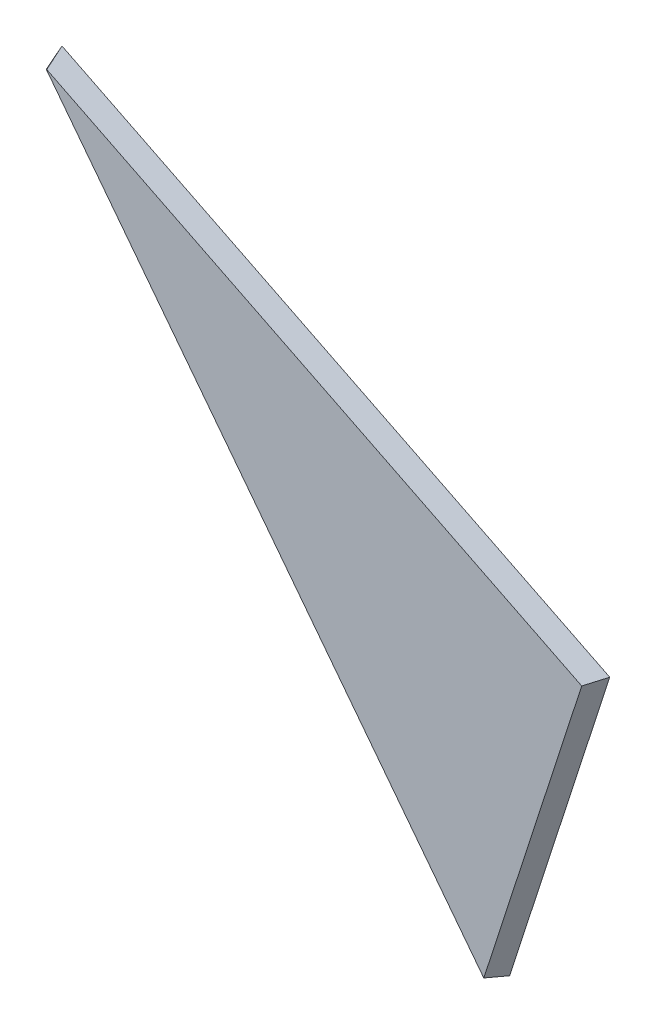
ISO-10303-21;
HEADER;
FILE_DESCRIPTION(('STEP AP214'),'2;1');
FILE_NAME('part.step','',(''),(''),'','','');
FILE_SCHEMA(('AUTOMOTIVE_DESIGN { 1 0 10303 214 1 1 1 1 }'));
ENDSEC;
DATA;
#1=APPLICATION_CONTEXT('core data for automotive mechanical design processes');
#2=APPLICATION_PROTOCOL_DEFINITION('international standard','automotive_design',2000,#1);
#3=PRODUCT_CONTEXT('',#1,'mechanical');
#4=PRODUCT('Part','Part','',(#3));
#5=PRODUCT_RELATED_PRODUCT_CATEGORY('part','',(#4));
#6=PRODUCT_DEFINITION_FORMATION('','',#4);
#7=PRODUCT_DEFINITION_CONTEXT('part definition',#1,'design');
#8=PRODUCT_DEFINITION('design','',#6,#7);
#9=PRODUCT_DEFINITION_SHAPE('','',#8);
#10=(LENGTH_UNIT() NAMED_UNIT(*) SI_UNIT(.MILLI.,.METRE.));
#11=(NAMED_UNIT(*) PLANE_ANGLE_UNIT() SI_UNIT($,.RADIAN.));
#12=(NAMED_UNIT(*) SI_UNIT($,.STERADIAN.) SOLID_ANGLE_UNIT());
#13=UNCERTAINTY_MEASURE_WITH_UNIT(LENGTH_MEASURE(1.E-05),#10,'distance_accuracy_value','');
#14=(GEOMETRIC_REPRESENTATION_CONTEXT(3) GLOBAL_UNCERTAINTY_ASSIGNED_CONTEXT((#13)) GLOBAL_UNIT_ASSIGNED_CONTEXT((#10,
#11,#12)) REPRESENTATION_CONTEXT('',''));
#15=CARTESIAN_POINT('',(0.,0.,0.));
#16=DIRECTION('',(0.,0.,1.));
#17=DIRECTION('',(1.,0.,0.));
#18=AXIS2_PLACEMENT_3D('',#15,#16,#17);
#19=CARTESIAN_POINT('',(0.,0.,60.));
#20=DIRECTION('',(0.,0.,-1.));
#21=DIRECTION('',(-1.,0.,0.));
#22=AXIS2_PLACEMENT_3D('',#19,#20,#21);
#23=PLANE('',#22);
#24=DIRECTION('',(0.308545213831799,0.951209677737506,0.));
#25=VECTOR('',#24,1.);
#26=CARTESIAN_POINT('',(523.22907497545,-169.720547004217,60.));
#27=LINE('',#26,#25);
#28=CARTESIAN_POINT('',(276.3644984007,-930.775860137303,60.));
#29=VERTEX_POINT('',#28);
#30=CARTESIAN_POINT('',(523.778367298486,-168.027141467019,60.));
#31=VERTEX_POINT('',#30);
#32=EDGE_CURVE('E108',#29,#31,#27,.T.);
#33=ORIENTED_EDGE('',*,*,#32,.T.);
#34=DIRECTION('',(0.895160704924565,-0.445743549991423,0.));
#35=VECTOR('',#34,1.);
#36=CARTESIAN_POINT('',(-849.589927608854,515.838957491439,60.));
#37=LINE('',#36,#35);
#38=CARTESIAN_POINT('',(-828.025045773762,505.100766090231,60.));
#39=VERTEX_POINT('',#38);
#40=EDGE_CURVE('E63',#39,#31,#37,.T.);
#41=ORIENTED_EDGE('',*,*,#40,.F.);
#42=DIRECTION('',(-0.998473286091908,-0.0552367356098018,0.));
#43=VECTOR('',#42,1.);
#44=CARTESIAN_POINT('',(-30.3839066761003,549.22722728409,60.));
#45=LINE('',#44,#43);
#46=CARTESIAN_POINT('',(-829.254457708692,505.032753552539,60.));
#47=VERTEX_POINT('',#46);
#48=EDGE_CURVE('E70',#39,#47,#45,.T.);
#49=ORIENTED_EDGE('',*,*,#48,.T.);
#50=DIRECTION('',(0.610109647488099,-0.792316993407277,0.));
#51=VECTOR('',#50,1.);
#52=CARTESIAN_POINT('',(-276.444979653998,-212.87155329238,60.));
#53=LINE('',#52,#51);
#54=EDGE_CURVE('E105',#47,#29,#53,.T.);
#55=ORIENTED_EDGE('',*,*,#54,.T.);
#56=EDGE_LOOP('',(#33,#41,#49,#55));
#57=FACE_BOUND('',#56,.T.);
#58=ADVANCED_FACE('F47',(#57),#23,.F.);
#59=CARTESIAN_POINT('',(0.,0.,0.));
#60=DIRECTION('',(0.,0.,-1.));
#61=DIRECTION('',(-1.,0.,0.));
#62=AXIS2_PLACEMENT_3D('',#59,#60,#61);
#63=PLANE('',#62);
#64=DIRECTION('',(0.895160704924565,-0.445743549991423,0.));
#65=VECTOR('',#64,1.);
#66=CARTESIAN_POINT('',(-849.589927608854,515.838957491439,0.));
#67=LINE('',#66,#65);
#68=CARTESIAN_POINT('',(-849.589927608854,515.838957491439,0.));
#69=VERTEX_POINT('',#68);
#70=CARTESIAN_POINT('',(534.560808216033,-173.396237167623,0.));
#71=VERTEX_POINT('',#70);
#72=EDGE_CURVE('E84',#69,#71,#67,.T.);
#73=ORIENTED_EDGE('',*,*,#72,.T.);
#74=DIRECTION('',(0.308545213831799,0.951209677737506,0.));
#75=VECTOR('',#74,1.);
#76=CARTESIAN_POINT('',(787.506047005333,606.405063542784,0.));
#77=LINE('',#76,#75);
#78=CARTESIAN_POINT('',(281.615569426732,-953.197537878031,0.));
#79=VERTEX_POINT('',#78);
#80=EDGE_CURVE('E102',#79,#71,#77,.T.);
#81=ORIENTED_EDGE('',*,*,#80,.F.);
#82=DIRECTION('',(0.610109647488099,-0.792316993407277,0.));
#83=VECTOR('',#82,1.);
#84=CARTESIAN_POINT('',(281.615569426732,-953.197537878031,0.));
#85=LINE('',#84,#83);
#86=EDGE_CURVE('E98',#69,#79,#85,.T.);
#87=ORIENTED_EDGE('',*,*,#86,.F.);
#88=EDGE_LOOP('',(#73,#81,#87));
#89=FACE_BOUND('',#88,.T.);
#90=ADVANCED_FACE('F101',(#89),#63,.T.);
#91=CARTESIAN_POINT('',(-30.3839066761003,549.22722728409,60.));
#92=DIRECTION('',(0.054179135509839,-0.979355837612682,-0.19474795148953));
#93=DIRECTION('',(-0.998473286091908,-0.0552367356098018,0.));
#94=AXIS2_PLACEMENT_3D('',#91,#92,#93);
#95=PLANE('',#94);
#96=DIRECTION('',(-0.333534383073139,0.166082804056673,-0.927993166733836));
#97=VECTOR('',#96,1.);
#98=CARTESIAN_POINT('',(-741.735665495433,462.133135272407,300.083059869803));
#99=LINE('',#98,#97);
#100=EDGE_CURVE('E87',#69,#39,#99,.F.);
#101=ORIENTED_EDGE('',*,*,#100,.F.);
#102=DIRECTION('',(0.316419420475128,-0.16814427228237,0.933598550794085));
#103=VECTOR('',#102,1.);
#104=CARTESIAN_POINT('',(-751.621867610542,463.779042424922,289.055705560655));
#105=LINE('',#104,#103);
#106=EDGE_CURVE('E13',#69,#47,#105,.T.);
#107=ORIENTED_EDGE('',*,*,#106,.T.);
#108=ORIENTED_EDGE('',*,*,#48,.F.);
#109=EDGE_LOOP('',(#101,#107,#108));
#110=FACE_BOUND('',#109,.T.);
#111=ADVANCED_FACE('F95',(#110),#95,.F.);
#112=CARTESIAN_POINT('',(523.22907497545,-169.720547004217,60.));
#113=DIRECTION('',(-0.932997170442229,0.30263759736263,-0.194747951489534));
#114=DIRECTION('',(0.308545213831799,0.951209677737506,0.));
#115=AXIS2_PLACEMENT_3D('',#112,#113,#114);
#116=PLANE('',#115);
#117=DIRECTION('',(-0.176191949467776,0.0877344420991918,0.98043820030244));
#118=VECTOR('',#117,1.);
#119=CARTESIAN_POINT('',(523.787492121827,-168.031685155239,59.9492239832649));
#120=LINE('',#119,#118);
#121=EDGE_CURVE('E88',#31,#71,#120,.F.);
#122=ORIENTED_EDGE('',*,*,#121,.F.);
#123=ORIENTED_EDGE('',*,*,#32,.F.);
#124=DIRECTION('',(0.0817065383336703,-0.348880764085259,-0.933598550794084));
#125=VECTOR('',#124,1.);
#126=CARTESIAN_POINT('',(256.318035420419,-845.1789732247,289.055705560657));
#127=LINE('',#126,#125);
#128=EDGE_CURVE('E56',#29,#79,#127,.T.);
#129=ORIENTED_EDGE('',*,*,#128,.T.);
#130=ORIENTED_EDGE('',*,*,#80,.T.);
#131=EDGE_LOOP('',(#122,#123,#129,#130));
#132=FACE_BOUND('',#131,.T.);
#133=ADVANCED_FACE('F129',(#132),#116,.F.);
#134=CARTESIAN_POINT('',(-276.444979653998,-212.87155329238,60.));
#135=DIRECTION('',(0.782529780721693,0.602573177954846,-0.156693035879251));
#136=DIRECTION('',(0.610109647488099,-0.792316993407277,0.));
#137=AXIS2_PLACEMENT_3D('',#134,#135,#136);
#138=PLANE('',#137);
#139=ORIENTED_EDGE('',*,*,#106,.F.);
#140=ORIENTED_EDGE('',*,*,#86,.T.);
#141=ORIENTED_EDGE('',*,*,#128,.F.);
#142=ORIENTED_EDGE('',*,*,#54,.F.);
#143=EDGE_LOOP('',(#139,#140,#141,#142));
#144=FACE_BOUND('',#143,.T.);
#145=ADVANCED_FACE('F49',(#144),#138,.F.);
#146=CARTESIAN_POINT('',(-849.589927608854,515.838957491439,0.));
#147=DIRECTION('',(-0.445743549991423,-0.895160704924565,0.));
#148=DIRECTION('',(0.895160704924565,-0.445743549991423,0.));
#149=AXIS2_PLACEMENT_3D('',#146,#147,#148);
#150=PLANE('',#149);
#151=ORIENTED_EDGE('',*,*,#100,.T.);
#152=ORIENTED_EDGE('',*,*,#40,.T.);
#153=ORIENTED_EDGE('',*,*,#121,.T.);
#154=ORIENTED_EDGE('',*,*,#72,.F.);
#155=EDGE_LOOP('',(#151,#152,#153,#154));
#156=FACE_BOUND('',#155,.T.);
#157=ADVANCED_FACE('F86',(#156),#150,.F.);
#158=CLOSED_SHELL('',(#58,#90,#111,#133,#145,#157));
#159=MANIFOLD_SOLID_BREP('B2',#158);
#160=ADVANCED_BREP_SHAPE_REPRESENTATION('',(#18,#159),#14);
#161=SHAPE_DEFINITION_REPRESENTATION(#9,#160);
ENDSEC;
END-ISO-10303-21;
